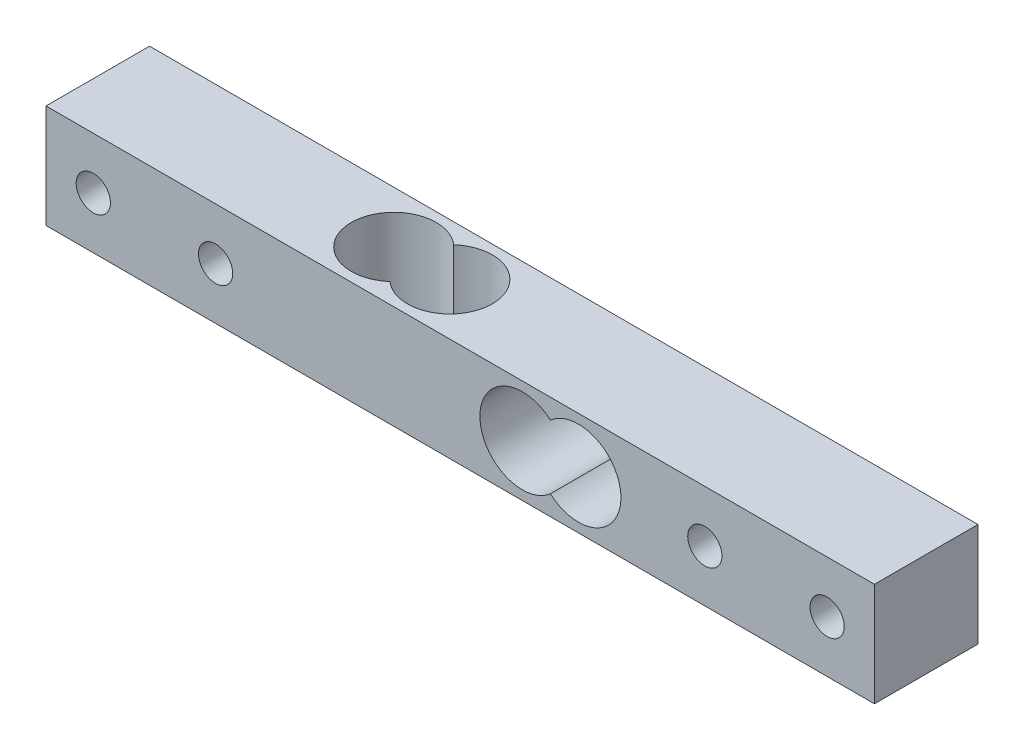
ISO-10303-21;
HEADER;
FILE_DESCRIPTION(('STEP AP214'),'2;1');
FILE_NAME('part.step','',(''),(''),'','','');
FILE_SCHEMA(('AUTOMOTIVE_DESIGN { 1 0 10303 214 1 1 1 1 }'));
ENDSEC;
DATA;
#1=APPLICATION_CONTEXT('core data for automotive mechanical design processes');
#2=APPLICATION_PROTOCOL_DEFINITION('international standard','automotive_design',2000,#1);
#3=PRODUCT_CONTEXT('',#1,'mechanical');
#4=PRODUCT('Part','Part','',(#3));
#5=PRODUCT_RELATED_PRODUCT_CATEGORY('part','',(#4));
#6=PRODUCT_DEFINITION_FORMATION('','',#4);
#7=PRODUCT_DEFINITION_CONTEXT('part definition',#1,'design');
#8=PRODUCT_DEFINITION('design','',#6,#7);
#9=PRODUCT_DEFINITION_SHAPE('','',#8);
#10=(LENGTH_UNIT() NAMED_UNIT(*) SI_UNIT(.MILLI.,.METRE.));
#11=(NAMED_UNIT(*) PLANE_ANGLE_UNIT() SI_UNIT($,.RADIAN.));
#12=(NAMED_UNIT(*) SI_UNIT($,.STERADIAN.) SOLID_ANGLE_UNIT());
#13=UNCERTAINTY_MEASURE_WITH_UNIT(LENGTH_MEASURE(1.E-05),#10,'distance_accuracy_value','');
#14=(GEOMETRIC_REPRESENTATION_CONTEXT(3) GLOBAL_UNCERTAINTY_ASSIGNED_CONTEXT((#13)) GLOBAL_UNIT_ASSIGNED_CONTEXT((#10,
#11,#12)) REPRESENTATION_CONTEXT('',''));
#15=CARTESIAN_POINT('',(0.,0.,0.));
#16=DIRECTION('',(0.,0.,1.));
#17=DIRECTION('',(1.,0.,0.));
#18=AXIS2_PLACEMENT_3D('',#15,#16,#17);
#19=CARTESIAN_POINT('',(50.8,6.35,6.35));
#20=DIRECTION('',(0.,0.,-1.));
#21=DIRECTION('',(-1.,0.,0.));
#22=AXIS2_PLACEMENT_3D('',#19,#20,#21);
#23=PLANE('',#22);
#24=CARTESIAN_POINT('',(45.,0.,6.35));
#25=DIRECTION('',(0.,0.,-1.));
#26=DIRECTION('',(-1.,0.,0.));
#27=AXIS2_PLACEMENT_3D('',#24,#25,#26);
#28=CIRCLE('',#27,2.1);
#29=CARTESIAN_POINT('',(42.9,0.,6.35));
#30=VERTEX_POINT('',#29);
#31=EDGE_CURVE('E234',#30,#30,#28,.T.);
#32=ORIENTED_EDGE('',*,*,#31,.T.);
#33=EDGE_LOOP('',(#32));
#34=FACE_BOUND('',#33,.T.);
#35=CARTESIAN_POINT('',(30.,0.,6.35));
#36=DIRECTION('',(0.,0.,-1.));
#37=DIRECTION('',(-1.,0.,0.));
#38=AXIS2_PLACEMENT_3D('',#35,#36,#37);
#39=CIRCLE('',#38,2.1);
#40=CARTESIAN_POINT('',(27.9,0.,6.35));
#41=VERTEX_POINT('',#40);
#42=EDGE_CURVE('E238',#41,#41,#39,.T.);
#43=ORIENTED_EDGE('',*,*,#42,.T.);
#44=EDGE_LOOP('',(#43));
#45=FACE_BOUND('',#44,.T.);
#46=CARTESIAN_POINT('',(-30.,0.,6.35));
#47=DIRECTION('',(0.,0.,-1.));
#48=DIRECTION('',(-1.,0.,0.));
#49=AXIS2_PLACEMENT_3D('',#46,#47,#48);
#50=CIRCLE('',#49,2.1);
#51=CARTESIAN_POINT('',(-32.1,0.,6.35));
#52=VERTEX_POINT('',#51);
#53=EDGE_CURVE('E247',#52,#52,#50,.T.);
#54=ORIENTED_EDGE('',*,*,#53,.T.);
#55=EDGE_LOOP('',(#54));
#56=FACE_BOUND('',#55,.T.);
#57=CARTESIAN_POINT('',(-45.,0.,6.35));
#58=DIRECTION('',(0.,0.,-1.));
#59=DIRECTION('',(-1.,0.,0.));
#60=AXIS2_PLACEMENT_3D('',#57,#58,#59);
#61=CIRCLE('',#60,2.1);
#62=CARTESIAN_POINT('',(-47.1,0.,6.35));
#63=VERTEX_POINT('',#62);
#64=EDGE_CURVE('E113',#63,#63,#61,.T.);
#65=ORIENTED_EDGE('',*,*,#64,.T.);
#66=EDGE_LOOP('',(#65));
#67=FACE_BOUND('',#66,.T.);
#68=CARTESIAN_POINT('',(14.5,0.,6.34999999999999));
#69=DIRECTION('',(0.,0.,-1.));
#70=DIRECTION('',(-1.,0.,0.));
#71=AXIS2_PLACEMENT_3D('',#68,#69,#70);
#72=CIRCLE('',#71,5.21);
#73=CARTESIAN_POINT('',(11.06,3.91286340165358,6.34999999999999));
#74=VERTEX_POINT('',#73);
#75=CARTESIAN_POINT('',(11.06,-3.91286340165358,6.34999999999999));
#76=VERTEX_POINT('',#75);
#77=EDGE_CURVE('E103',#74,#76,#72,.T.);
#78=ORIENTED_EDGE('',*,*,#77,.T.);
#79=CARTESIAN_POINT('',(7.62,0.,6.34999999999999));
#80=DIRECTION('',(0.,0.,-1.));
#81=DIRECTION('',(-1.,0.,0.));
#82=AXIS2_PLACEMENT_3D('',#79,#80,#81);
#83=CIRCLE('',#82,5.21);
#84=EDGE_CURVE('E101',#76,#74,#83,.T.);
#85=ORIENTED_EDGE('',*,*,#84,.T.);
#86=EDGE_LOOP('',(#78,#85));
#87=FACE_BOUND('',#86,.T.);
#88=DIRECTION('',(0.,-1.,0.));
#89=VECTOR('',#88,1.);
#90=CARTESIAN_POINT('',(-50.8,6.35,6.35));
#91=LINE('',#90,#89);
#92=CARTESIAN_POINT('',(-50.8,6.35,6.35));
#93=VERTEX_POINT('',#92);
#94=CARTESIAN_POINT('',(-50.8,-6.35,6.35));
#95=VERTEX_POINT('',#94);
#96=EDGE_CURVE('E139',#93,#95,#91,.T.);
#97=ORIENTED_EDGE('',*,*,#96,.T.);
#98=DIRECTION('',(-1.,0.,0.));
#99=VECTOR('',#98,1.);
#100=CARTESIAN_POINT('',(50.8,-6.35,6.35));
#101=LINE('',#100,#99);
#102=CARTESIAN_POINT('',(50.8,-6.35,6.35));
#103=VERTEX_POINT('',#102);
#104=EDGE_CURVE('E11',#103,#95,#101,.T.);
#105=ORIENTED_EDGE('',*,*,#104,.F.);
#106=DIRECTION('',(0.,-1.,0.));
#107=VECTOR('',#106,1.);
#108=CARTESIAN_POINT('',(50.8,6.35,6.35));
#109=LINE('',#108,#107);
#110=CARTESIAN_POINT('',(50.8,6.35,6.35));
#111=VERTEX_POINT('',#110);
#112=EDGE_CURVE('E140',#111,#103,#109,.T.);
#113=ORIENTED_EDGE('',*,*,#112,.F.);
#114=DIRECTION('',(-1.,0.,0.));
#115=VECTOR('',#114,1.);
#116=CARTESIAN_POINT('',(50.8,6.35,6.35));
#117=LINE('',#116,#115);
#118=EDGE_CURVE('E150',#111,#93,#117,.T.);
#119=ORIENTED_EDGE('',*,*,#118,.T.);
#120=EDGE_LOOP('',(#97,#105,#113,#119));
#121=FACE_BOUND('',#120,.T.);
#122=ADVANCED_FACE('F37',(#34,#45,#56,#67,#87,#121),#23,.F.);
#123=CARTESIAN_POINT('',(50.8,-6.35,-6.35));
#124=DIRECTION('',(0.,1.,0.));
#125=DIRECTION('',(0.,0.,1.));
#126=AXIS2_PLACEMENT_3D('',#123,#124,#125);
#127=PLANE('',#126);
#128=CARTESIAN_POINT('',(-7.62,-6.34999999999999,0.));
#129=DIRECTION('',(0.,1.,0.));
#130=DIRECTION('',(0.,0.,1.));
#131=AXIS2_PLACEMENT_3D('',#128,#129,#130);
#132=CIRCLE('',#131,5.21);
#133=CARTESIAN_POINT('',(-11.06,-6.34999999999999,3.91286340165358));
#134=VERTEX_POINT('',#133);
#135=CARTESIAN_POINT('',(-11.06,-6.34999999999999,-3.91286340165358));
#136=VERTEX_POINT('',#135);
#137=EDGE_CURVE('E131',#134,#136,#132,.T.);
#138=ORIENTED_EDGE('',*,*,#137,.T.);
#139=CARTESIAN_POINT('',(-14.5,-6.34999999999999,0.));
#140=DIRECTION('',(0.,1.,0.));
#141=DIRECTION('',(0.,0.,1.));
#142=AXIS2_PLACEMENT_3D('',#139,#140,#141);
#143=CIRCLE('',#142,5.21);
#144=EDGE_CURVE('E136',#136,#134,#143,.T.);
#145=ORIENTED_EDGE('',*,*,#144,.T.);
#146=EDGE_LOOP('',(#138,#145));
#147=FACE_BOUND('',#146,.T.);
#148=DIRECTION('',(0.,0.,-1.));
#149=VECTOR('',#148,1.);
#150=CARTESIAN_POINT('',(-50.8,-6.35,-6.35));
#151=LINE('',#150,#149);
#152=CARTESIAN_POINT('',(-50.8,-6.35,-6.35));
#153=VERTEX_POINT('',#152);
#154=EDGE_CURVE('E153',#95,#153,#151,.T.);
#155=ORIENTED_EDGE('',*,*,#154,.T.);
#156=DIRECTION('',(-1.,0.,0.));
#157=VECTOR('',#156,1.);
#158=CARTESIAN_POINT('',(50.8,-6.35,-6.35));
#159=LINE('',#158,#157);
#160=CARTESIAN_POINT('',(50.8,-6.35,-6.35));
#161=VERTEX_POINT('',#160);
#162=EDGE_CURVE('E44',#161,#153,#159,.T.);
#163=ORIENTED_EDGE('',*,*,#162,.F.);
#164=DIRECTION('',(0.,0.,-1.));
#165=VECTOR('',#164,1.);
#166=CARTESIAN_POINT('',(50.8,-6.35,-6.35));
#167=LINE('',#166,#165);
#168=EDGE_CURVE('E143',#103,#161,#167,.T.);
#169=ORIENTED_EDGE('',*,*,#168,.F.);
#170=ORIENTED_EDGE('',*,*,#104,.T.);
#171=EDGE_LOOP('',(#155,#163,#169,#170));
#172=FACE_BOUND('',#171,.T.);
#173=ADVANCED_FACE('F181',(#147,#172),#127,.F.);
#174=CARTESIAN_POINT('',(50.8,6.35,-6.35));
#175=DIRECTION('',(0.,0.,1.));
#176=DIRECTION('',(1.,0.,0.));
#177=AXIS2_PLACEMENT_3D('',#174,#175,#176);
#178=PLANE('',#177);
#179=CARTESIAN_POINT('',(45.,0.,-6.35));
#180=DIRECTION('',(0.,0.,-1.));
#181=DIRECTION('',(-1.,0.,0.));
#182=AXIS2_PLACEMENT_3D('',#179,#180,#181);
#183=CIRCLE('',#182,2.1);
#184=CARTESIAN_POINT('',(42.9,0.,-6.35));
#185=VERTEX_POINT('',#184);
#186=EDGE_CURVE('E231',#185,#185,#183,.T.);
#187=ORIENTED_EDGE('',*,*,#186,.F.);
#188=EDGE_LOOP('',(#187));
#189=FACE_BOUND('',#188,.T.);
#190=CARTESIAN_POINT('',(30.,0.,-6.35));
#191=DIRECTION('',(0.,0.,-1.));
#192=DIRECTION('',(-1.,0.,0.));
#193=AXIS2_PLACEMENT_3D('',#190,#191,#192);
#194=CIRCLE('',#193,2.1);
#195=CARTESIAN_POINT('',(27.9,0.,-6.35));
#196=VERTEX_POINT('',#195);
#197=EDGE_CURVE('E235',#196,#196,#194,.T.);
#198=ORIENTED_EDGE('',*,*,#197,.F.);
#199=EDGE_LOOP('',(#198));
#200=FACE_BOUND('',#199,.T.);
#201=CARTESIAN_POINT('',(-30.,0.,-6.35));
#202=DIRECTION('',(0.,0.,-1.));
#203=DIRECTION('',(-1.,0.,0.));
#204=AXIS2_PLACEMENT_3D('',#201,#202,#203);
#205=CIRCLE('',#204,2.1);
#206=CARTESIAN_POINT('',(-32.1,0.,-6.35));
#207=VERTEX_POINT('',#206);
#208=EDGE_CURVE('E244',#207,#207,#205,.T.);
#209=ORIENTED_EDGE('',*,*,#208,.F.);
#210=EDGE_LOOP('',(#209));
#211=FACE_BOUND('',#210,.T.);
#212=CARTESIAN_POINT('',(-45.,0.,-6.35));
#213=DIRECTION('',(0.,0.,-1.));
#214=DIRECTION('',(-1.,0.,0.));
#215=AXIS2_PLACEMENT_3D('',#212,#213,#214);
#216=CIRCLE('',#215,2.1);
#217=CARTESIAN_POINT('',(-47.1,0.,-6.35));
#218=VERTEX_POINT('',#217);
#219=EDGE_CURVE('E116',#218,#218,#216,.T.);
#220=ORIENTED_EDGE('',*,*,#219,.F.);
#221=EDGE_LOOP('',(#220));
#222=FACE_BOUND('',#221,.T.);
#223=CARTESIAN_POINT('',(14.5,0.,-6.35));
#224=DIRECTION('',(0.,0.,-1.));
#225=DIRECTION('',(-1.,0.,0.));
#226=AXIS2_PLACEMENT_3D('',#223,#224,#225);
#227=CIRCLE('',#226,5.21);
#228=CARTESIAN_POINT('',(11.06,3.91286340165358,-6.34999999999999));
#229=VERTEX_POINT('',#228);
#230=CARTESIAN_POINT('',(11.06,-3.91286340165358,-6.35));
#231=VERTEX_POINT('',#230);
#232=EDGE_CURVE('E107',#229,#231,#227,.T.);
#233=ORIENTED_EDGE('',*,*,#232,.F.);
#234=CARTESIAN_POINT('',(7.62,0.,-6.35));
#235=DIRECTION('',(0.,0.,-1.));
#236=DIRECTION('',(-1.,0.,0.));
#237=AXIS2_PLACEMENT_3D('',#234,#235,#236);
#238=CIRCLE('',#237,5.21);
#239=EDGE_CURVE('E58',#231,#229,#238,.T.);
#240=ORIENTED_EDGE('',*,*,#239,.F.);
#241=EDGE_LOOP('',(#233,#240));
#242=FACE_BOUND('',#241,.T.);
#243=DIRECTION('',(0.,1.,0.));
#244=VECTOR('',#243,1.);
#245=CARTESIAN_POINT('',(-50.8,6.35,-6.35));
#246=LINE('',#245,#244);
#247=CARTESIAN_POINT('',(-50.8,6.35,-6.35));
#248=VERTEX_POINT('',#247);
#249=EDGE_CURVE('E155',#153,#248,#246,.T.);
#250=ORIENTED_EDGE('',*,*,#249,.T.);
#251=DIRECTION('',(-1.,0.,0.));
#252=VECTOR('',#251,1.);
#253=CARTESIAN_POINT('',(50.8,6.35,-6.35));
#254=LINE('',#253,#252);
#255=CARTESIAN_POINT('',(50.8,6.35,-6.35));
#256=VERTEX_POINT('',#255);
#257=EDGE_CURVE('E160',#256,#248,#254,.T.);
#258=ORIENTED_EDGE('',*,*,#257,.F.);
#259=DIRECTION('',(0.,1.,0.));
#260=VECTOR('',#259,1.);
#261=CARTESIAN_POINT('',(50.8,6.35,-6.35));
#262=LINE('',#261,#260);
#263=EDGE_CURVE('E146',#161,#256,#262,.T.);
#264=ORIENTED_EDGE('',*,*,#263,.F.);
#265=ORIENTED_EDGE('',*,*,#162,.T.);
#266=EDGE_LOOP('',(#250,#258,#264,#265));
#267=FACE_BOUND('',#266,.T.);
#268=ADVANCED_FACE('F111',(#189,#200,#211,#222,#242,#267),#178,.F.);
#269=CARTESIAN_POINT('',(50.8,6.35,-6.35));
#270=DIRECTION('',(0.,-1.,0.));
#271=DIRECTION('',(0.,0.,-1.));
#272=AXIS2_PLACEMENT_3D('',#269,#270,#271);
#273=PLANE('',#272);
#274=CARTESIAN_POINT('',(-7.62,6.35,0.));
#275=DIRECTION('',(0.,1.,0.));
#276=DIRECTION('',(0.,0.,1.));
#277=AXIS2_PLACEMENT_3D('',#274,#275,#276);
#278=CIRCLE('',#277,5.21);
#279=CARTESIAN_POINT('',(-11.06,6.34999999999999,3.91286340165358));
#280=VERTEX_POINT('',#279);
#281=CARTESIAN_POINT('',(-11.06,6.35,-3.91286340165358));
#282=VERTEX_POINT('',#281);
#283=EDGE_CURVE('E125',#280,#282,#278,.T.);
#284=ORIENTED_EDGE('',*,*,#283,.F.);
#285=CARTESIAN_POINT('',(-14.5,6.35,0.));
#286=DIRECTION('',(0.,1.,0.));
#287=DIRECTION('',(0.,0.,1.));
#288=AXIS2_PLACEMENT_3D('',#285,#286,#287);
#289=CIRCLE('',#288,5.21);
#290=EDGE_CURVE('E123',#282,#280,#289,.T.);
#291=ORIENTED_EDGE('',*,*,#290,.F.);
#292=EDGE_LOOP('',(#284,#291));
#293=FACE_BOUND('',#292,.T.);
#294=DIRECTION('',(0.,0.,1.));
#295=VECTOR('',#294,1.);
#296=CARTESIAN_POINT('',(-50.8,6.35,-6.35));
#297=LINE('',#296,#295);
#298=EDGE_CURVE('E144',#248,#93,#297,.T.);
#299=ORIENTED_EDGE('',*,*,#298,.T.);
#300=ORIENTED_EDGE('',*,*,#118,.F.);
#301=DIRECTION('',(0.,0.,1.));
#302=VECTOR('',#301,1.);
#303=CARTESIAN_POINT('',(50.8,6.35,-6.35));
#304=LINE('',#303,#302);
#305=EDGE_CURVE('E148',#256,#111,#304,.T.);
#306=ORIENTED_EDGE('',*,*,#305,.F.);
#307=ORIENTED_EDGE('',*,*,#257,.T.);
#308=EDGE_LOOP('',(#299,#300,#306,#307));
#309=FACE_BOUND('',#308,.T.);
#310=ADVANCED_FACE('F174',(#293,#309),#273,.F.);
#311=CARTESIAN_POINT('',(50.8,0.,0.));
#312=DIRECTION('',(-1.,0.,0.));
#313=DIRECTION('',(0.,0.,1.));
#314=AXIS2_PLACEMENT_3D('',#311,#312,#313);
#315=PLANE('',#314);
#316=ORIENTED_EDGE('',*,*,#112,.T.);
#317=ORIENTED_EDGE('',*,*,#168,.T.);
#318=ORIENTED_EDGE('',*,*,#263,.T.);
#319=ORIENTED_EDGE('',*,*,#305,.T.);
#320=EDGE_LOOP('',(#316,#317,#318,#319));
#321=FACE_BOUND('',#320,.T.);
#322=ADVANCED_FACE('F180',(#321),#315,.F.);
#323=CARTESIAN_POINT('',(-50.8,0.,0.));
#324=DIRECTION('',(-1.,0.,0.));
#325=DIRECTION('',(0.,0.,1.));
#326=AXIS2_PLACEMENT_3D('',#323,#324,#325);
#327=PLANE('',#326);
#328=ORIENTED_EDGE('',*,*,#96,.F.);
#329=ORIENTED_EDGE('',*,*,#298,.F.);
#330=ORIENTED_EDGE('',*,*,#249,.F.);
#331=ORIENTED_EDGE('',*,*,#154,.F.);
#332=EDGE_LOOP('',(#328,#329,#330,#331));
#333=FACE_BOUND('',#332,.T.);
#334=ADVANCED_FACE('F171',(#333),#327,.T.);
#335=CARTESIAN_POINT('',(-14.5,-95.25,0.));
#336=DIRECTION('',(0.,1.,0.));
#337=DIRECTION('',(0.,0.,1.));
#338=AXIS2_PLACEMENT_3D('',#335,#336,#337);
#339=CYLINDRICAL_SURFACE('',#338,5.21);
#340=DIRECTION('',(0.,1.,0.));
#341=VECTOR('',#340,1.);
#342=CARTESIAN_POINT('',(-11.06,-95.25,-3.91286340165358));
#343=LINE('',#342,#341);
#344=EDGE_CURVE('E129',#136,#282,#343,.T.);
#345=ORIENTED_EDGE('',*,*,#344,.T.);
#346=ORIENTED_EDGE('',*,*,#290,.T.);
#347=DIRECTION('',(0.,1.,0.));
#348=VECTOR('',#347,1.);
#349=CARTESIAN_POINT('',(-11.06,-95.25,3.91286340165358));
#350=LINE('',#349,#348);
#351=EDGE_CURVE('E128',#134,#280,#350,.T.);
#352=ORIENTED_EDGE('',*,*,#351,.F.);
#353=ORIENTED_EDGE('',*,*,#144,.F.);
#354=EDGE_LOOP('',(#345,#346,#352,#353));
#355=FACE_BOUND('',#354,.T.);
#356=ADVANCED_FACE('F197',(#355),#339,.F.);
#357=CARTESIAN_POINT('',(-7.62,-95.25,0.));
#358=DIRECTION('',(0.,1.,0.));
#359=DIRECTION('',(0.,0.,1.));
#360=AXIS2_PLACEMENT_3D('',#357,#358,#359);
#361=CYLINDRICAL_SURFACE('',#360,5.21);
#362=ORIENTED_EDGE('',*,*,#351,.T.);
#363=ORIENTED_EDGE('',*,*,#283,.T.);
#364=ORIENTED_EDGE('',*,*,#344,.F.);
#365=ORIENTED_EDGE('',*,*,#137,.F.);
#366=EDGE_LOOP('',(#362,#363,#364,#365));
#367=FACE_BOUND('',#366,.T.);
#368=ADVANCED_FACE('F202',(#367),#361,.F.);
#369=CARTESIAN_POINT('',(7.62,0.,95.25));
#370=DIRECTION('',(0.,0.,-1.));
#371=DIRECTION('',(-1.,0.,0.));
#372=AXIS2_PLACEMENT_3D('',#369,#370,#371);
#373=CYLINDRICAL_SURFACE('',#372,5.21);
#374=DIRECTION('',(0.,0.,-1.));
#375=VECTOR('',#374,1.);
#376=CARTESIAN_POINT('',(11.06,-3.91286340165358,95.25));
#377=LINE('',#376,#375);
#378=EDGE_CURVE('E51',#76,#231,#377,.T.);
#379=ORIENTED_EDGE('',*,*,#378,.T.);
#380=ORIENTED_EDGE('',*,*,#239,.T.);
#381=DIRECTION('',(0.,0.,-1.));
#382=VECTOR('',#381,1.);
#383=CARTESIAN_POINT('',(11.06,3.91286340165358,95.25));
#384=LINE('',#383,#382);
#385=EDGE_CURVE('E104',#74,#229,#384,.T.);
#386=ORIENTED_EDGE('',*,*,#385,.F.);
#387=ORIENTED_EDGE('',*,*,#84,.F.);
#388=EDGE_LOOP('',(#379,#380,#386,#387));
#389=FACE_BOUND('',#388,.T.);
#390=ADVANCED_FACE('F99',(#389),#373,.F.);
#391=CARTESIAN_POINT('',(14.5,0.,95.25));
#392=DIRECTION('',(0.,0.,-1.));
#393=DIRECTION('',(-1.,0.,0.));
#394=AXIS2_PLACEMENT_3D('',#391,#392,#393);
#395=CYLINDRICAL_SURFACE('',#394,5.21);
#396=ORIENTED_EDGE('',*,*,#385,.T.);
#397=ORIENTED_EDGE('',*,*,#232,.T.);
#398=ORIENTED_EDGE('',*,*,#378,.F.);
#399=ORIENTED_EDGE('',*,*,#77,.F.);
#400=EDGE_LOOP('',(#396,#397,#398,#399));
#401=FACE_BOUND('',#400,.T.);
#402=ADVANCED_FACE('F108',(#401),#395,.F.);
#403=CARTESIAN_POINT('',(-45.,0.,-6.35));
#404=DIRECTION('',(0.,0.,-1.));
#405=DIRECTION('',(-1.,0.,0.));
#406=AXIS2_PLACEMENT_3D('',#403,#404,#405);
#407=CYLINDRICAL_SURFACE('',#406,2.1);
#408=ORIENTED_EDGE('',*,*,#219,.T.);
#409=EDGE_LOOP('',(#408));
#410=FACE_BOUND('',#409,.T.);
#411=ORIENTED_EDGE('',*,*,#64,.F.);
#412=EDGE_LOOP('',(#411));
#413=FACE_BOUND('',#412,.T.);
#414=ADVANCED_FACE('F211',(#410,#413),#407,.F.);
#415=CARTESIAN_POINT('',(-30.,0.,-6.35));
#416=DIRECTION('',(0.,0.,-1.));
#417=DIRECTION('',(-1.,0.,0.));
#418=AXIS2_PLACEMENT_3D('',#415,#416,#417);
#419=CYLINDRICAL_SURFACE('',#418,2.1);
#420=ORIENTED_EDGE('',*,*,#208,.T.);
#421=EDGE_LOOP('',(#420));
#422=FACE_BOUND('',#421,.T.);
#423=ORIENTED_EDGE('',*,*,#53,.F.);
#424=EDGE_LOOP('',(#423));
#425=FACE_BOUND('',#424,.T.);
#426=ADVANCED_FACE('F214',(#422,#425),#419,.F.);
#427=CARTESIAN_POINT('',(30.,0.,-6.35));
#428=DIRECTION('',(0.,0.,-1.));
#429=DIRECTION('',(-1.,0.,0.));
#430=AXIS2_PLACEMENT_3D('',#427,#428,#429);
#431=CYLINDRICAL_SURFACE('',#430,2.1);
#432=ORIENTED_EDGE('',*,*,#197,.T.);
#433=EDGE_LOOP('',(#432));
#434=FACE_BOUND('',#433,.T.);
#435=ORIENTED_EDGE('',*,*,#42,.F.);
#436=EDGE_LOOP('',(#435));
#437=FACE_BOUND('',#436,.T.);
#438=ADVANCED_FACE('F218',(#434,#437),#431,.F.);
#439=CARTESIAN_POINT('',(45.,0.,-6.35));
#440=DIRECTION('',(0.,0.,-1.));
#441=DIRECTION('',(-1.,0.,0.));
#442=AXIS2_PLACEMENT_3D('',#439,#440,#441);
#443=CYLINDRICAL_SURFACE('',#442,2.1);
#444=ORIENTED_EDGE('',*,*,#186,.T.);
#445=EDGE_LOOP('',(#444));
#446=FACE_BOUND('',#445,.T.);
#447=ORIENTED_EDGE('',*,*,#31,.F.);
#448=EDGE_LOOP('',(#447));
#449=FACE_BOUND('',#448,.T.);
#450=ADVANCED_FACE('F222',(#446,#449),#443,.F.);
#451=CLOSED_SHELL('',(#122,#173,#268,#310,#322,#334,#356,#368,#390,#402,#414,#426,#438,#450));
#452=MANIFOLD_SOLID_BREP('B2',#451);
#453=ADVANCED_BREP_SHAPE_REPRESENTATION('',(#18,#452),#14);
#454=SHAPE_DEFINITION_REPRESENTATION(#9,#453);
ENDSEC;
END-ISO-10303-21;
